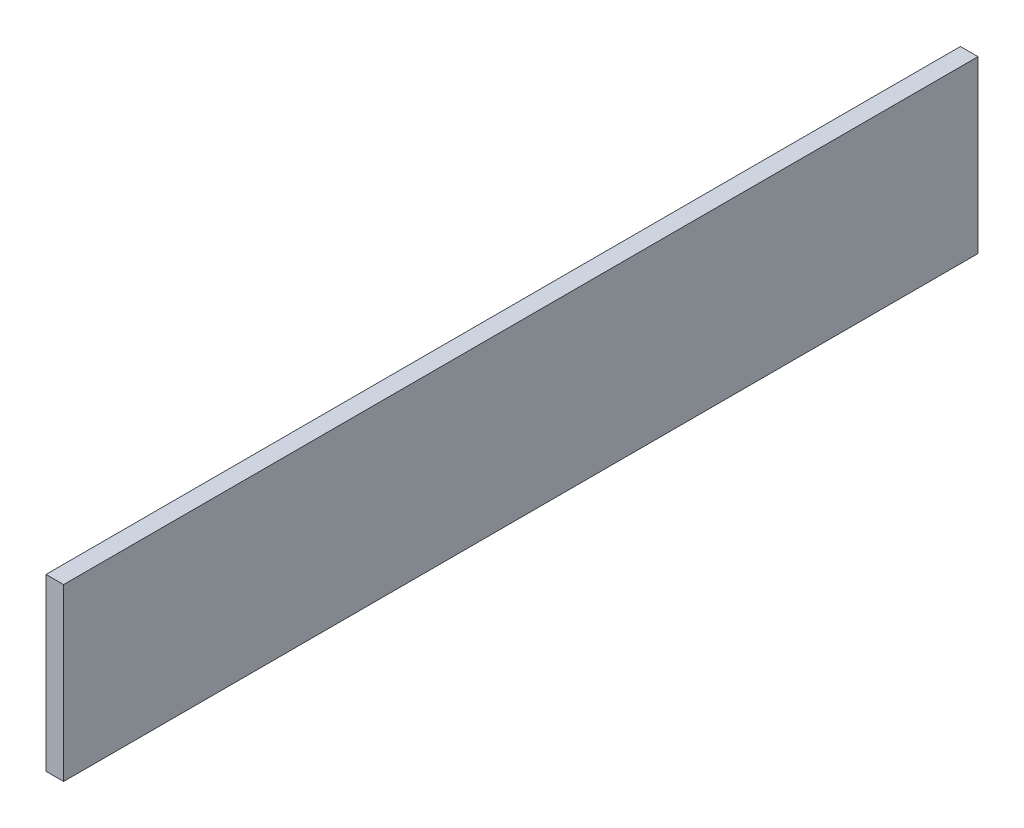
ISO-10303-21;
HEADER;
FILE_DESCRIPTION(('STEP AP214'),'2;1');
FILE_NAME('part.step','',(''),(''),'','','');
FILE_SCHEMA(('AUTOMOTIVE_DESIGN { 1 0 10303 214 1 1 1 1 }'));
ENDSEC;
DATA;
#1=APPLICATION_CONTEXT('core data for automotive mechanical design processes');
#2=APPLICATION_PROTOCOL_DEFINITION('international standard','automotive_design',2000,#1);
#3=PRODUCT_CONTEXT('',#1,'mechanical');
#4=PRODUCT('Part','Part','',(#3));
#5=PRODUCT_RELATED_PRODUCT_CATEGORY('part','',(#4));
#6=PRODUCT_DEFINITION_FORMATION('','',#4);
#7=PRODUCT_DEFINITION_CONTEXT('part definition',#1,'design');
#8=PRODUCT_DEFINITION('design','',#6,#7);
#9=PRODUCT_DEFINITION_SHAPE('','',#8);
#10=(LENGTH_UNIT() NAMED_UNIT(*) SI_UNIT(.MILLI.,.METRE.));
#11=(NAMED_UNIT(*) PLANE_ANGLE_UNIT() SI_UNIT($,.RADIAN.));
#12=(NAMED_UNIT(*) SI_UNIT($,.STERADIAN.) SOLID_ANGLE_UNIT());
#13=UNCERTAINTY_MEASURE_WITH_UNIT(LENGTH_MEASURE(1.E-05),#10,'distance_accuracy_value','');
#14=(GEOMETRIC_REPRESENTATION_CONTEXT(3) GLOBAL_UNCERTAINTY_ASSIGNED_CONTEXT((#13)) GLOBAL_UNIT_ASSIGNED_CONTEXT((#10,
#11,#12)) REPRESENTATION_CONTEXT('',''));
#15=CARTESIAN_POINT('',(0.,0.,0.));
#16=DIRECTION('',(0.,0.,1.));
#17=DIRECTION('',(1.,0.,0.));
#18=AXIS2_PLACEMENT_3D('',#15,#16,#17);
#19=CARTESIAN_POINT('',(6.35,-30.775,165.));
#20=DIRECTION('',(0.,0.,-1.));
#21=DIRECTION('',(-1.,0.,0.));
#22=AXIS2_PLACEMENT_3D('',#19,#20,#21);
#23=PLANE('',#22);
#24=DIRECTION('',(0.,-1.,0.));
#25=VECTOR('',#24,1.);
#26=CARTESIAN_POINT('',(0.,-30.775,165.));
#27=LINE('',#26,#25);
#28=CARTESIAN_POINT('',(0.,30.775,165.));
#29=VERTEX_POINT('',#28);
#30=CARTESIAN_POINT('',(0.,-30.775,165.));
#31=VERTEX_POINT('',#30);
#32=EDGE_CURVE('E107',#29,#31,#27,.T.);
#33=ORIENTED_EDGE('',*,*,#32,.T.);
#34=DIRECTION('',(-1.,0.,0.));
#35=VECTOR('',#34,1.);
#36=CARTESIAN_POINT('',(6.35,-30.775,165.));
#37=LINE('',#36,#35);
#38=CARTESIAN_POINT('',(6.35,-30.775,165.));
#39=VERTEX_POINT('',#38);
#40=EDGE_CURVE('E11',#39,#31,#37,.T.);
#41=ORIENTED_EDGE('',*,*,#40,.F.);
#42=DIRECTION('',(0.,-1.,0.));
#43=VECTOR('',#42,1.);
#44=CARTESIAN_POINT('',(6.35,-30.775,165.));
#45=LINE('',#44,#43);
#46=CARTESIAN_POINT('',(6.35,30.775,165.));
#47=VERTEX_POINT('',#46);
#48=EDGE_CURVE('E95',#47,#39,#45,.T.);
#49=ORIENTED_EDGE('',*,*,#48,.F.);
#50=DIRECTION('',(-1.,0.,0.));
#51=VECTOR('',#50,1.);
#52=CARTESIAN_POINT('',(6.35,30.775,165.));
#53=LINE('',#52,#51);
#54=EDGE_CURVE('E103',#47,#29,#53,.T.);
#55=ORIENTED_EDGE('',*,*,#54,.T.);
#56=EDGE_LOOP('',(#33,#41,#49,#55));
#57=FACE_BOUND('',#56,.T.);
#58=ADVANCED_FACE('F44',(#57),#23,.F.);
#59=CARTESIAN_POINT('',(6.35,-30.775,-165.));
#60=DIRECTION('',(0.,1.,0.));
#61=DIRECTION('',(0.,0.,1.));
#62=AXIS2_PLACEMENT_3D('',#59,#60,#61);
#63=PLANE('',#62);
#64=DIRECTION('',(0.,0.,-1.));
#65=VECTOR('',#64,1.);
#66=CARTESIAN_POINT('',(0.,-30.775,-165.));
#67=LINE('',#66,#65);
#68=CARTESIAN_POINT('',(0.,-30.775,-165.));
#69=VERTEX_POINT('',#68);
#70=EDGE_CURVE('E99',#31,#69,#67,.T.);
#71=ORIENTED_EDGE('',*,*,#70,.T.);
#72=DIRECTION('',(-1.,0.,0.));
#73=VECTOR('',#72,1.);
#74=CARTESIAN_POINT('',(6.35,-30.775,-165.));
#75=LINE('',#74,#73);
#76=CARTESIAN_POINT('',(6.35,-30.775,-165.));
#77=VERTEX_POINT('',#76);
#78=EDGE_CURVE('E52',#77,#69,#75,.T.);
#79=ORIENTED_EDGE('',*,*,#78,.F.);
#80=DIRECTION('',(0.,0.,-1.));
#81=VECTOR('',#80,1.);
#82=CARTESIAN_POINT('',(6.35,-30.775,-165.));
#83=LINE('',#82,#81);
#84=EDGE_CURVE('E90',#39,#77,#83,.T.);
#85=ORIENTED_EDGE('',*,*,#84,.F.);
#86=ORIENTED_EDGE('',*,*,#40,.T.);
#87=EDGE_LOOP('',(#71,#79,#85,#86));
#88=FACE_BOUND('',#87,.T.);
#89=ADVANCED_FACE('F98',(#88),#63,.F.);
#90=CARTESIAN_POINT('',(6.35,-30.775,-165.));
#91=DIRECTION('',(0.,0.,1.));
#92=DIRECTION('',(1.,0.,0.));
#93=AXIS2_PLACEMENT_3D('',#90,#91,#92);
#94=PLANE('',#93);
#95=DIRECTION('',(0.,1.,0.));
#96=VECTOR('',#95,1.);
#97=CARTESIAN_POINT('',(0.,-30.775,-165.));
#98=LINE('',#97,#96);
#99=CARTESIAN_POINT('',(0.,30.775,-165.));
#100=VERTEX_POINT('',#99);
#101=EDGE_CURVE('E77',#69,#100,#98,.T.);
#102=ORIENTED_EDGE('',*,*,#101,.T.);
#103=DIRECTION('',(-1.,0.,0.));
#104=VECTOR('',#103,1.);
#105=CARTESIAN_POINT('',(6.35,30.775,-165.));
#106=LINE('',#105,#104);
#107=CARTESIAN_POINT('',(6.35,30.775,-165.));
#108=VERTEX_POINT('',#107);
#109=EDGE_CURVE('E100',#108,#100,#106,.T.);
#110=ORIENTED_EDGE('',*,*,#109,.F.);
#111=DIRECTION('',(0.,1.,0.));
#112=VECTOR('',#111,1.);
#113=CARTESIAN_POINT('',(6.35,-30.775,-165.));
#114=LINE('',#113,#112);
#115=EDGE_CURVE('E93',#77,#108,#114,.T.);
#116=ORIENTED_EDGE('',*,*,#115,.F.);
#117=ORIENTED_EDGE('',*,*,#78,.T.);
#118=EDGE_LOOP('',(#102,#110,#116,#117));
#119=FACE_BOUND('',#118,.T.);
#120=ADVANCED_FACE('F101',(#119),#94,.F.);
#121=CARTESIAN_POINT('',(6.35,30.775,-165.));
#122=DIRECTION('',(0.,-1.,0.));
#123=DIRECTION('',(0.,0.,-1.));
#124=AXIS2_PLACEMENT_3D('',#121,#122,#123);
#125=PLANE('',#124);
#126=DIRECTION('',(0.,0.,1.));
#127=VECTOR('',#126,1.);
#128=CARTESIAN_POINT('',(0.,30.775,-165.));
#129=LINE('',#128,#127);
#130=EDGE_CURVE('E83',#100,#29,#129,.T.);
#131=ORIENTED_EDGE('',*,*,#130,.T.);
#132=ORIENTED_EDGE('',*,*,#54,.F.);
#133=DIRECTION('',(0.,0.,1.));
#134=VECTOR('',#133,1.);
#135=CARTESIAN_POINT('',(6.35,30.775,-165.));
#136=LINE('',#135,#134);
#137=EDGE_CURVE('E60',#108,#47,#136,.T.);
#138=ORIENTED_EDGE('',*,*,#137,.F.);
#139=ORIENTED_EDGE('',*,*,#109,.T.);
#140=EDGE_LOOP('',(#131,#132,#138,#139));
#141=FACE_BOUND('',#140,.T.);
#142=ADVANCED_FACE('F114',(#141),#125,.F.);
#143=CARTESIAN_POINT('',(6.35,0.,0.));
#144=DIRECTION('',(1.,0.,0.));
#145=DIRECTION('',(0.,0.,-1.));
#146=AXIS2_PLACEMENT_3D('',#143,#144,#145);
#147=PLANE('',#146);
#148=ORIENTED_EDGE('',*,*,#48,.T.);
#149=ORIENTED_EDGE('',*,*,#84,.T.);
#150=ORIENTED_EDGE('',*,*,#115,.T.);
#151=ORIENTED_EDGE('',*,*,#137,.T.);
#152=EDGE_LOOP('',(#148,#149,#150,#151));
#153=FACE_BOUND('',#152,.T.);
#154=ADVANCED_FACE('F91',(#153),#147,.T.);
#155=CARTESIAN_POINT('',(0.,0.,0.));
#156=DIRECTION('',(1.,0.,0.));
#157=DIRECTION('',(0.,0.,-1.));
#158=AXIS2_PLACEMENT_3D('',#155,#156,#157);
#159=PLANE('',#158);
#160=ORIENTED_EDGE('',*,*,#32,.F.);
#161=ORIENTED_EDGE('',*,*,#130,.F.);
#162=ORIENTED_EDGE('',*,*,#101,.F.);
#163=ORIENTED_EDGE('',*,*,#70,.F.);
#164=EDGE_LOOP('',(#160,#161,#162,#163));
#165=FACE_BOUND('',#164,.T.);
#166=ADVANCED_FACE('F117',(#165),#159,.F.);
#167=CLOSED_SHELL('',(#58,#89,#120,#142,#154,#166));
#168=MANIFOLD_SOLID_BREP('B2',#167);
#169=ADVANCED_BREP_SHAPE_REPRESENTATION('',(#18,#168),#14);
#170=SHAPE_DEFINITION_REPRESENTATION(#9,#169);
ENDSEC;
END-ISO-10303-21;
